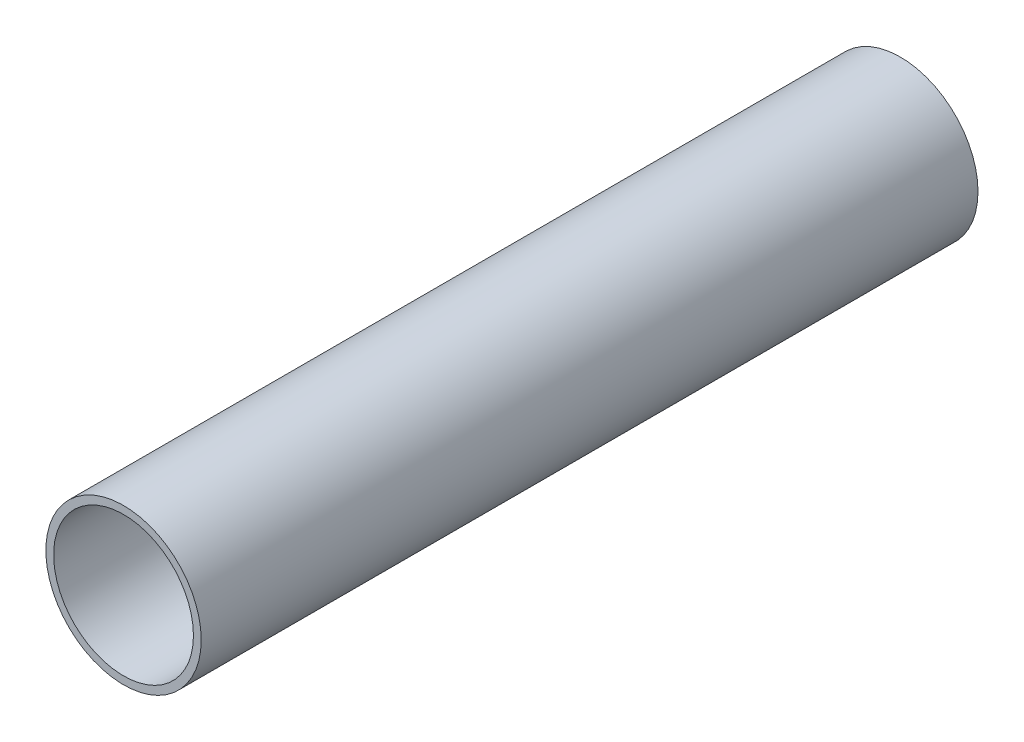
ISO-10303-21;
HEADER;
FILE_DESCRIPTION(('STEP AP214'),'2;1');
FILE_NAME('part.step','',(''),(''),'','','');
FILE_SCHEMA(('AUTOMOTIVE_DESIGN { 1 0 10303 214 1 1 1 1 }'));
ENDSEC;
DATA;
#1=APPLICATION_CONTEXT('core data for automotive mechanical design processes');
#2=APPLICATION_PROTOCOL_DEFINITION('international standard','automotive_design',2000,#1);
#3=PRODUCT_CONTEXT('',#1,'mechanical');
#4=PRODUCT('Part','Part','',(#3));
#5=PRODUCT_RELATED_PRODUCT_CATEGORY('part','',(#4));
#6=PRODUCT_DEFINITION_FORMATION('','',#4);
#7=PRODUCT_DEFINITION_CONTEXT('part definition',#1,'design');
#8=PRODUCT_DEFINITION('design','',#6,#7);
#9=PRODUCT_DEFINITION_SHAPE('','',#8);
#10=(LENGTH_UNIT() NAMED_UNIT(*) SI_UNIT(.MILLI.,.METRE.));
#11=(NAMED_UNIT(*) PLANE_ANGLE_UNIT() SI_UNIT($,.RADIAN.));
#12=(NAMED_UNIT(*) SI_UNIT($,.STERADIAN.) SOLID_ANGLE_UNIT());
#13=UNCERTAINTY_MEASURE_WITH_UNIT(LENGTH_MEASURE(1.E-05),#10,'distance_accuracy_value','');
#14=(GEOMETRIC_REPRESENTATION_CONTEXT(3) GLOBAL_UNCERTAINTY_ASSIGNED_CONTEXT((#13)) GLOBAL_UNIT_ASSIGNED_CONTEXT((#10,
#11,#12)) REPRESENTATION_CONTEXT('',''));
#15=CARTESIAN_POINT('',(0.,0.,0.));
#16=DIRECTION('',(0.,0.,1.));
#17=DIRECTION('',(1.,0.,0.));
#18=AXIS2_PLACEMENT_3D('',#15,#16,#17);
#19=CARTESIAN_POINT('',(0.,0.,100.));
#20=DIRECTION('',(0.,0.,1.));
#21=DIRECTION('',(1.,0.,0.));
#22=AXIS2_PLACEMENT_3D('',#19,#20,#21);
#23=PLANE('',#22);
#24=CARTESIAN_POINT('',(0.,0.,100.));
#25=DIRECTION('',(0.,0.,1.));
#26=DIRECTION('',(1.,0.,0.));
#27=AXIS2_PLACEMENT_3D('',#24,#25,#26);
#28=CIRCLE('',#27,10.);
#29=CARTESIAN_POINT('',(10.,0.,100.));
#30=VERTEX_POINT('',#29);
#31=EDGE_CURVE('E10',#30,#30,#28,.T.);
#32=ORIENTED_EDGE('',*,*,#31,.T.);
#33=EDGE_LOOP('',(#32));
#34=FACE_BOUND('',#33,.T.);
#35=CARTESIAN_POINT('',(0.,0.,100.));
#36=DIRECTION('',(0.,0.,1.));
#37=DIRECTION('',(1.,0.,0.));
#38=AXIS2_PLACEMENT_3D('',#35,#36,#37);
#39=CIRCLE('',#38,9.);
#40=CARTESIAN_POINT('',(9.,0.,100.));
#41=VERTEX_POINT('',#40);
#42=EDGE_CURVE('E50',#41,#41,#39,.T.);
#43=ORIENTED_EDGE('',*,*,#42,.F.);
#44=EDGE_LOOP('',(#43));
#45=FACE_BOUND('',#44,.T.);
#46=ADVANCED_FACE('F39',(#34,#45),#23,.T.);
#47=CARTESIAN_POINT('',(0.,0.,0.));
#48=DIRECTION('',(0.,0.,1.));
#49=DIRECTION('',(1.,0.,0.));
#50=AXIS2_PLACEMENT_3D('',#47,#48,#49);
#51=PLANE('',#50);
#52=CARTESIAN_POINT('',(0.,0.,0.));
#53=DIRECTION('',(0.,0.,1.));
#54=DIRECTION('',(1.,0.,0.));
#55=AXIS2_PLACEMENT_3D('',#52,#53,#54);
#56=CIRCLE('',#55,10.);
#57=CARTESIAN_POINT('',(10.,0.,0.));
#58=VERTEX_POINT('',#57);
#59=EDGE_CURVE('E43',#58,#58,#56,.T.);
#60=ORIENTED_EDGE('',*,*,#59,.F.);
#61=EDGE_LOOP('',(#60));
#62=FACE_BOUND('',#61,.T.);
#63=CARTESIAN_POINT('',(0.,0.,0.));
#64=DIRECTION('',(0.,0.,1.));
#65=DIRECTION('',(1.,0.,0.));
#66=AXIS2_PLACEMENT_3D('',#63,#64,#65);
#67=CIRCLE('',#66,9.);
#68=CARTESIAN_POINT('',(9.,0.,0.));
#69=VERTEX_POINT('',#68);
#70=EDGE_CURVE('E52',#69,#69,#67,.T.);
#71=ORIENTED_EDGE('',*,*,#70,.T.);
#72=EDGE_LOOP('',(#71));
#73=FACE_BOUND('',#72,.T.);
#74=ADVANCED_FACE('F62',(#62,#73),#51,.F.);
#75=CARTESIAN_POINT('',(0.,0.,100.));
#76=DIRECTION('',(0.,0.,-1.));
#77=DIRECTION('',(-1.,0.,0.));
#78=AXIS2_PLACEMENT_3D('',#75,#76,#77);
#79=CYLINDRICAL_SURFACE('',#78,10.);
#80=ORIENTED_EDGE('',*,*,#31,.F.);
#81=EDGE_LOOP('',(#80));
#82=FACE_BOUND('',#81,.T.);
#83=ORIENTED_EDGE('',*,*,#59,.T.);
#84=EDGE_LOOP('',(#83));
#85=FACE_BOUND('',#84,.T.);
#86=ADVANCED_FACE('F41',(#82,#85),#79,.T.);
#87=CARTESIAN_POINT('',(0.,0.,100.));
#88=DIRECTION('',(0.,0.,-1.));
#89=DIRECTION('',(-1.,0.,0.));
#90=AXIS2_PLACEMENT_3D('',#87,#88,#89);
#91=CYLINDRICAL_SURFACE('',#90,9.);
#92=ORIENTED_EDGE('',*,*,#42,.T.);
#93=EDGE_LOOP('',(#92));
#94=FACE_BOUND('',#93,.T.);
#95=ORIENTED_EDGE('',*,*,#70,.F.);
#96=EDGE_LOOP('',(#95));
#97=FACE_BOUND('',#96,.T.);
#98=ADVANCED_FACE('F58',(#94,#97),#91,.F.);
#99=CLOSED_SHELL('',(#46,#74,#86,#98));
#100=MANIFOLD_SOLID_BREP('B2',#99);
#101=ADVANCED_BREP_SHAPE_REPRESENTATION('',(#18,#100),#14);
#102=SHAPE_DEFINITION_REPRESENTATION(#9,#101);
ENDSEC;
END-ISO-10303-21;
